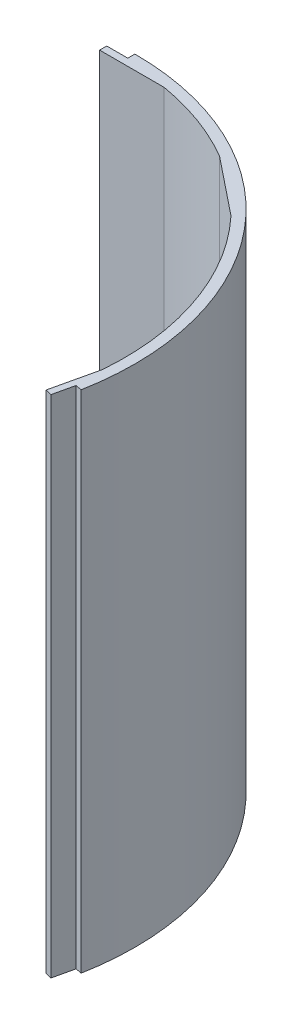
ISO-10303-21;
HEADER;
FILE_DESCRIPTION(('STEP AP214'),'2;1');
FILE_NAME('part.step','',(''),(''),'','','');
FILE_SCHEMA(('AUTOMOTIVE_DESIGN { 1 0 10303 214 1 1 1 1 }'));
ENDSEC;
DATA;
#1=APPLICATION_CONTEXT('core data for automotive mechanical design processes');
#2=APPLICATION_PROTOCOL_DEFINITION('international standard','automotive_design',2000,#1);
#3=PRODUCT_CONTEXT('',#1,'mechanical');
#4=PRODUCT('Part','Part','',(#3));
#5=PRODUCT_RELATED_PRODUCT_CATEGORY('part','',(#4));
#6=PRODUCT_DEFINITION_FORMATION('','',#4);
#7=PRODUCT_DEFINITION_CONTEXT('part definition',#1,'design');
#8=PRODUCT_DEFINITION('design','',#6,#7);
#9=PRODUCT_DEFINITION_SHAPE('','',#8);
#10=(LENGTH_UNIT() NAMED_UNIT(*) SI_UNIT(.MILLI.,.METRE.));
#11=(NAMED_UNIT(*) PLANE_ANGLE_UNIT() SI_UNIT($,.RADIAN.));
#12=(NAMED_UNIT(*) SI_UNIT($,.STERADIAN.) SOLID_ANGLE_UNIT());
#13=UNCERTAINTY_MEASURE_WITH_UNIT(LENGTH_MEASURE(1.E-05),#10,'distance_accuracy_value','');
#14=(GEOMETRIC_REPRESENTATION_CONTEXT(3) GLOBAL_UNCERTAINTY_ASSIGNED_CONTEXT((#13)) GLOBAL_UNIT_ASSIGNED_CONTEXT((#10,
#11,#12)) REPRESENTATION_CONTEXT('',''));
#15=CARTESIAN_POINT('',(0.,0.,0.));
#16=DIRECTION('',(0.,0.,1.));
#17=DIRECTION('',(1.,0.,0.));
#18=AXIS2_PLACEMENT_3D('',#15,#16,#17);
#19=CARTESIAN_POINT('',(0.,180.389576212052,0.));
#20=DIRECTION('',(0.,-1.,0.));
#21=DIRECTION('',(0.,0.,-1.));
#22=AXIS2_PLACEMENT_3D('',#19,#20,#21);
#23=CYLINDRICAL_SURFACE('',#22,49.);
#24=DIRECTION('',(0.,-1.,0.));
#25=VECTOR('',#24,1.);
#26=CARTESIAN_POINT('',(23.8221858110528,22.,-42.8194285714285));
#27=LINE('',#26,#25);
#28=CARTESIAN_POINT('',(23.8221858110528,22.,-42.8194285714285));
#29=VERTEX_POINT('',#28);
#30=CARTESIAN_POINT('',(23.8221858110528,14.7071067811865,-42.8194285714285));
#31=VERTEX_POINT('',#30);
#32=EDGE_CURVE('E231',#29,#31,#27,.T.);
#33=ORIENTED_EDGE('',*,*,#32,.F.);
#34=CARTESIAN_POINT('',(0.,22.,0.));
#35=DIRECTION('',(0.,1.,0.));
#36=DIRECTION('',(0.,0.,1.));
#37=AXIS2_PLACEMENT_3D('',#34,#35,#36);
#38=CIRCLE('',#37,49.);
#39=CARTESIAN_POINT('',(24.8620843048444,22.,-42.224125378968));
#40=VERTEX_POINT('',#39);
#41=EDGE_CURVE('E241',#40,#29,#38,.T.);
#42=ORIENTED_EDGE('',*,*,#41,.F.);
#43=DIRECTION('',(0.,-1.,0.));
#44=VECTOR('',#43,1.);
#45=CARTESIAN_POINT('',(24.8620843048444,180.389576212052,-42.224125378968));
#46=LINE('',#45,#44);
#47=CARTESIAN_POINT('',(24.8620843048444,96.,-42.224125378968));
#48=VERTEX_POINT('',#47);
#49=EDGE_CURVE('E390',#48,#40,#46,.T.);
#50=ORIENTED_EDGE('',*,*,#49,.F.);
#51=CARTESIAN_POINT('',(0.,96.,0.));
#52=DIRECTION('',(0.,1.,0.));
#53=DIRECTION('',(0.,0.,1.));
#54=AXIS2_PLACEMENT_3D('',#51,#52,#53);
#55=CIRCLE('',#54,49.);
#56=CARTESIAN_POINT('',(8.25287828578612,96.,-48.3));
#57=VERTEX_POINT('',#56);
#58=EDGE_CURVE('E426',#57,#48,#55,.F.);
#59=ORIENTED_EDGE('',*,*,#58,.F.);
#60=DIRECTION('',(0.,-1.,0.));
#61=VECTOR('',#60,1.);
#62=CARTESIAN_POINT('',(8.25287828578612,180.389576212052,-48.3));
#63=LINE('',#62,#61);
#64=CARTESIAN_POINT('',(8.25287828578612,22.,-48.3));
#65=VERTEX_POINT('',#64);
#66=EDGE_CURVE('E361',#57,#65,#63,.T.);
#67=ORIENTED_EDGE('',*,*,#66,.T.);
#68=DIRECTION('',(0.,-1.,0.));
#69=VECTOR('',#68,1.);
#70=CARTESIAN_POINT('',(8.25287828578612,22.,-48.3));
#71=LINE('',#70,#69);
#72=CARTESIAN_POINT('',(8.25287828578612,17.5,-48.3));
#73=VERTEX_POINT('',#72);
#74=EDGE_CURVE('E235',#65,#73,#71,.T.);
#75=ORIENTED_EDGE('',*,*,#74,.T.);
#76=CARTESIAN_POINT('',(0.,17.5,0.));
#77=DIRECTION('',(0.,-1.,0.));
#78=DIRECTION('',(0.,0.,-1.));
#79=AXIS2_PLACEMENT_3D('',#76,#77,#78);
#80=CIRCLE('',#79,49.);
#81=CARTESIAN_POINT('',(21.3188530280703,17.5,-44.1192305640923));
#82=VERTEX_POINT('',#81);
#83=EDGE_CURVE('E355',#82,#73,#80,.F.);
#84=ORIENTED_EDGE('',*,*,#83,.F.);
#85=CARTESIAN_POINT('',(0.,22.9599850669726,0.));
#86=DIRECTION('',(0.666989294417188,0.707106781186548,0.234787736334037));
#87=DIRECTION('',(0.666989294417188,-0.707106781186548,0.234787736334037));
#88=AXIS2_PLACEMENT_3D('',#85,#86,#87);
#89=ELLIPSE('',#88,69.2964645562816,49.);
#90=EDGE_CURVE('E250',#82,#31,#89,.F.);
#91=ORIENTED_EDGE('',*,*,#90,.T.);
#92=EDGE_LOOP('',(#33,#42,#50,#59,#67,#75,#84,#91));
#93=FACE_BOUND('',#92,.T.);
#94=ADVANCED_FACE('F39',(#93),#23,.F.);
#95=CARTESIAN_POINT('',(0.,12.,0.));
#96=DIRECTION('',(0.,1.,0.));
#97=DIRECTION('',(0.,0.,1.));
#98=AXIS2_PLACEMENT_3D('',#95,#96,#97);
#99=CIRCLE('',#98,49.);
#100=CARTESIAN_POINT('',(24.8620843048444,12.,-42.224125378968));
#101=VERTEX_POINT('',#100);
#102=CARTESIAN_POINT('',(24.2645651205459,12.,-42.5703051376283));
#103=VERTEX_POINT('',#102);
#104=EDGE_CURVE('E270',#101,#103,#99,.T.);
#105=ORIENTED_EDGE('',*,*,#104,.T.);
#106=DIRECTION('',(0.,-1.,0.));
#107=VECTOR('',#106,1.);
#108=CARTESIAN_POINT('',(24.2645651205459,180.389576212052,-42.5703051376283));
#109=LINE('',#108,#107);
#110=CARTESIAN_POINT('',(24.2645651205459,0.,-42.5703051376283));
#111=VERTEX_POINT('',#110);
#112=EDGE_CURVE('E352',#111,#103,#109,.F.);
#113=ORIENTED_EDGE('',*,*,#112,.F.);
#114=CARTESIAN_POINT('',(0.,0.,0.));
#115=DIRECTION('',(0.,-1.,0.));
#116=DIRECTION('',(0.,0.,-1.));
#117=AXIS2_PLACEMENT_3D('',#114,#115,#116);
#118=CIRCLE('',#117,49.);
#119=CARTESIAN_POINT('',(24.8620843048444,0.,-42.224125378968));
#120=VERTEX_POINT('',#119);
#121=EDGE_CURVE('E391',#111,#120,#118,.T.);
#122=ORIENTED_EDGE('',*,*,#121,.T.);
#123=EDGE_CURVE('E394',#101,#120,#46,.T.);
#124=ORIENTED_EDGE('',*,*,#123,.F.);
#125=EDGE_LOOP('',(#105,#113,#122,#124));
#126=FACE_BOUND('',#125,.T.);
#127=ADVANCED_FACE('F529',(#126),#23,.F.);
#128=CARTESIAN_POINT('',(0.,0.,0.));
#129=DIRECTION('',(0.,-1.,0.));
#130=DIRECTION('',(0.,0.,-1.));
#131=AXIS2_PLACEMENT_3D('',#128,#129,#130);
#132=PLANE('',#131);
#133=ORIENTED_EDGE('',*,*,#121,.F.);
#134=DIRECTION('',(0.332040001002474,0.,-0.943265306122449));
#135=VECTOR('',#134,1.);
#136=CARTESIAN_POINT('',(8.25628641569456,0.,2.90630571478695));
#137=LINE('',#136,#135);
#138=CARTESIAN_POINT('',(24.9390649476221,0.,-44.4864365794597));
#139=VERTEX_POINT('',#138);
#140=EDGE_CURVE('E398',#111,#139,#137,.T.);
#141=ORIENTED_EDGE('',*,*,#140,.T.);
#142=CARTESIAN_POINT('',(0.,0.,0.));
#143=DIRECTION('',(0.,1.,0.));
#144=DIRECTION('',(0.,0.,1.));
#145=AXIS2_PLACEMENT_3D('',#142,#143,#144);
#146=CIRCLE('',#145,51.);
#147=CARTESIAN_POINT('',(50.1311597152053,0.,9.37373061318567));
#148=VERTEX_POINT('',#147);
#149=EDGE_CURVE('E362',#148,#139,#146,.T.);
#150=ORIENTED_EDGE('',*,*,#149,.F.);
#151=DIRECTION('',(0.975,0.,0.222204860432889));
#152=VECTOR('',#151,1.);
#153=CARTESIAN_POINT('',(50.1311597152053,0.,9.37373061318567));
#154=LINE('',#153,#152);
#155=CARTESIAN_POINT('',(48.9506597208658,0.,9.10469180653618));
#156=VERTEX_POINT('',#155);
#157=EDGE_CURVE('E367',#156,#148,#154,.T.);
#158=ORIENTED_EDGE('',*,*,#157,.F.);
#159=DIRECTION('',(0.222204860432889,0.,-0.975));
#160=VECTOR('',#159,1.);
#161=CARTESIAN_POINT('',(48.9506597208658,0.,9.10469180653618));
#162=LINE('',#161,#160);
#163=CARTESIAN_POINT('',(48.0618402791342,0.,13.0046918065362));
#164=VERTEX_POINT('',#163);
#165=EDGE_CURVE('E371',#164,#156,#162,.T.);
#166=ORIENTED_EDGE('',*,*,#165,.F.);
#167=DIRECTION('',(0.975,0.,0.222204860432889));
#168=VECTOR('',#167,1.);
#169=CARTESIAN_POINT('',(48.0618402791342,0.,13.0046918065362));
#170=LINE('',#169,#168);
#171=CARTESIAN_POINT('',(46.8430902791342,0.,12.7269357309951));
#172=VERTEX_POINT('',#171);
#173=EDGE_CURVE('E375',#172,#164,#170,.T.);
#174=ORIENTED_EDGE('',*,*,#173,.F.);
#175=DIRECTION('',(-0.222204860432889,0.,0.975));
#176=VECTOR('',#175,1.);
#177=CARTESIAN_POINT('',(46.8430902791342,0.,12.7269357309951));
#178=LINE('',#177,#176);
#179=CARTESIAN_POINT('',(48.8389610049885,0.,3.96936870965766));
#180=VERTEX_POINT('',#179);
#181=EDGE_CURVE('E379',#180,#172,#178,.T.);
#182=ORIENTED_EDGE('',*,*,#181,.F.);
#183=CARTESIAN_POINT('',(0.,0.,0.));
#184=DIRECTION('',(0.,-1.,0.));
#185=DIRECTION('',(0.,0.,1.));
#186=AXIS2_PLACEMENT_3D('',#183,#184,#185);
#187=CIRCLE('',#186,49.);
#188=CARTESIAN_POINT('',(35.7629156951556,0.,-33.4964753516126));
#189=VERTEX_POINT('',#188);
#190=EDGE_CURVE('E383',#189,#180,#187,.T.);
#191=ORIENTED_EDGE('',*,*,#190,.F.);
#192=DIRECTION('',(0.7806247497998,0.,0.625));
#193=VECTOR('',#192,1.);
#194=CARTESIAN_POINT('',(35.7629156951556,0.,-33.4964753516126));
#195=LINE('',#194,#193);
#196=EDGE_CURVE('E387',#120,#189,#195,.T.);
#197=ORIENTED_EDGE('',*,*,#196,.F.);
#198=EDGE_LOOP('',(#133,#141,#150,#158,#166,#174,#182,#191,#197));
#199=FACE_BOUND('',#198,.T.);
#200=ADVANCED_FACE('F525',(#199),#132,.T.);
#201=CARTESIAN_POINT('',(35.7629156951556,180.389576212052,-33.4964753516126));
#202=DIRECTION('',(0.625,0.,-0.7806247497998));
#203=DIRECTION('',(-0.7806247497998,0.,-0.625));
#204=AXIS2_PLACEMENT_3D('',#201,#202,#203);
#205=PLANE('',#204);
#206=ORIENTED_EDGE('',*,*,#49,.T.);
#207=CARTESIAN_POINT('',(24.8620843048442,22.,-42.2241253789681));
#208=CARTESIAN_POINT('',(25.1031195105589,21.9559751173701,-42.0311427665025));
#209=CARTESIAN_POINT('',(25.3444302517059,21.9148005384506,-41.8379395491365));
#210=CARTESIAN_POINT('',(25.8276029012661,21.8381519727396,-41.4510918274206));
#211=CARTESIAN_POINT('',(26.0694648098991,21.8026779882227,-41.2574473228946));
#212=CARTESIAN_POINT('',(26.3116022541843,21.770054309691,-41.0635822132923));
#213=B_SPLINE_CURVE_WITH_KNOTS('',3,(#207,#208,#209,#210,#211,#212),.UNSPECIFIED.,.F.,.F.,(4,2,
4),(0.,0.935565778812049,1.87113193094878),.UNSPECIFIED.);
#214=CARTESIAN_POINT('',(26.3116022541843,21.770054309691,-41.0635822132923));
#215=VERTEX_POINT('',#214);
#216=EDGE_CURVE('E11',#40,#215,#213,.T.);
#217=ORIENTED_EDGE('',*,*,#216,.T.);
#218=DIRECTION('',(0.,-1.,0.));
#219=VECTOR('',#218,1.);
#220=CARTESIAN_POINT('',(26.3116022541843,22.,-41.0635822132923));
#221=LINE('',#220,#219);
#222=CARTESIAN_POINT('',(26.3116022541843,12.,-41.0635822132923));
#223=VERTEX_POINT('',#222);
#224=EDGE_CURVE('E269',#215,#223,#221,.T.);
#225=ORIENTED_EDGE('',*,*,#224,.T.);
#226=DIRECTION('',(-0.780624749799799,0.,-0.625000000000001));
#227=VECTOR('',#226,1.);
#228=CARTESIAN_POINT('',(26.3116022541843,12.,-41.0635822132923));
#229=LINE('',#228,#227);
#230=EDGE_CURVE('E261',#223,#101,#229,.T.);
#231=ORIENTED_EDGE('',*,*,#230,.T.);
#232=ORIENTED_EDGE('',*,*,#123,.T.);
#233=ORIENTED_EDGE('',*,*,#196,.T.);
#234=DIRECTION('',(0.,-1.,0.));
#235=VECTOR('',#234,1.);
#236=CARTESIAN_POINT('',(35.7629156951556,180.389576212052,-33.4964753516126));
#237=LINE('',#236,#235);
#238=CARTESIAN_POINT('',(35.7629156951556,96.,-33.4964753516126));
#239=VERTEX_POINT('',#238);
#240=EDGE_CURVE('E386',#239,#189,#237,.T.);
#241=ORIENTED_EDGE('',*,*,#240,.F.);
#242=DIRECTION('',(0.7806247497998,0.,0.625));
#243=VECTOR('',#242,1.);
#244=CARTESIAN_POINT('',(35.7629156951556,96.,-33.4964753516126));
#245=LINE('',#244,#243);
#246=EDGE_CURVE('E423',#48,#239,#245,.T.);
#247=ORIENTED_EDGE('',*,*,#246,.F.);
#248=EDGE_LOOP('',(#206,#217,#225,#231,#232,#233,#241,#247));
#249=FACE_BOUND('',#248,.T.);
#250=ADVANCED_FACE('F528',(#249),#205,.F.);
#251=CARTESIAN_POINT('',(0.,180.389576212052,0.));
#252=DIRECTION('',(0.,-1.,0.));
#253=DIRECTION('',(0.,0.,-1.));
#254=AXIS2_PLACEMENT_3D('',#251,#252,#253);
#255=CYLINDRICAL_SURFACE('',#254,49.);
#256=CARTESIAN_POINT('',(0.,96.,0.));
#257=DIRECTION('',(0.,1.,0.));
#258=DIRECTION('',(0.,0.,1.));
#259=AXIS2_PLACEMENT_3D('',#256,#257,#258);
#260=CIRCLE('',#259,49.);
#261=CARTESIAN_POINT('',(48.8389610049885,96.,3.96936870965766));
#262=VERTEX_POINT('',#261);
#263=EDGE_CURVE('E420',#239,#262,#260,.F.);
#264=ORIENTED_EDGE('',*,*,#263,.F.);
#265=ORIENTED_EDGE('',*,*,#240,.T.);
#266=ORIENTED_EDGE('',*,*,#190,.T.);
#267=DIRECTION('',(0.,-1.,0.));
#268=VECTOR('',#267,1.);
#269=CARTESIAN_POINT('',(48.8389610049885,180.389576212052,3.96936870965766));
#270=LINE('',#269,#268);
#271=EDGE_CURVE('E382',#262,#180,#270,.T.);
#272=ORIENTED_EDGE('',*,*,#271,.F.);
#273=EDGE_LOOP('',(#264,#265,#266,#272));
#274=FACE_BOUND('',#273,.T.);
#275=ADVANCED_FACE('F566',(#274),#255,.F.);
#276=CARTESIAN_POINT('',(46.8430902791342,180.389576212052,12.7269357309951));
#277=DIRECTION('',(0.975,0.,0.222204860432889));
#278=DIRECTION('',(0.222204860432889,0.,-0.975));
#279=AXIS2_PLACEMENT_3D('',#276,#277,#278);
#280=PLANE('',#279);
#281=DIRECTION('',(-0.222204860432889,0.,0.975));
#282=VECTOR('',#281,1.);
#283=CARTESIAN_POINT('',(46.8430902791342,96.,12.7269357309951));
#284=LINE('',#283,#282);
#285=CARTESIAN_POINT('',(46.8430902791342,96.,12.7269357309951));
#286=VERTEX_POINT('',#285);
#287=EDGE_CURVE('E417',#262,#286,#284,.T.);
#288=ORIENTED_EDGE('',*,*,#287,.F.);
#289=ORIENTED_EDGE('',*,*,#271,.T.);
#290=ORIENTED_EDGE('',*,*,#181,.T.);
#291=DIRECTION('',(0.,-1.,0.));
#292=VECTOR('',#291,1.);
#293=CARTESIAN_POINT('',(46.8430902791342,180.389576212052,12.7269357309951));
#294=LINE('',#293,#292);
#295=EDGE_CURVE('E378',#286,#172,#294,.T.);
#296=ORIENTED_EDGE('',*,*,#295,.F.);
#297=EDGE_LOOP('',(#288,#289,#290,#296));
#298=FACE_BOUND('',#297,.T.);
#299=ADVANCED_FACE('F562',(#298),#280,.F.);
#300=CARTESIAN_POINT('',(48.0618402791342,180.389576212052,13.0046918065362));
#301=DIRECTION('',(0.222204860432889,0.,-0.975));
#302=DIRECTION('',(-0.975,0.,-0.222204860432889));
#303=AXIS2_PLACEMENT_3D('',#300,#301,#302);
#304=PLANE('',#303);
#305=DIRECTION('',(0.975,0.,0.222204860432889));
#306=VECTOR('',#305,1.);
#307=CARTESIAN_POINT('',(48.0618402791342,96.,13.0046918065362));
#308=LINE('',#307,#306);
#309=CARTESIAN_POINT('',(48.0618402791342,96.,13.0046918065362));
#310=VERTEX_POINT('',#309);
#311=EDGE_CURVE('E414',#286,#310,#308,.T.);
#312=ORIENTED_EDGE('',*,*,#311,.F.);
#313=ORIENTED_EDGE('',*,*,#295,.T.);
#314=ORIENTED_EDGE('',*,*,#173,.T.);
#315=DIRECTION('',(0.,-1.,0.));
#316=VECTOR('',#315,1.);
#317=CARTESIAN_POINT('',(48.0618402791342,180.389576212052,13.0046918065362));
#318=LINE('',#317,#316);
#319=EDGE_CURVE('E374',#310,#164,#318,.T.);
#320=ORIENTED_EDGE('',*,*,#319,.F.);
#321=EDGE_LOOP('',(#312,#313,#314,#320));
#322=FACE_BOUND('',#321,.T.);
#323=ADVANCED_FACE('F558',(#322),#304,.F.);
#324=CARTESIAN_POINT('',(48.9506597208658,180.389576212052,9.10469180653618));
#325=DIRECTION('',(-0.975,0.,-0.222204860432889));
#326=DIRECTION('',(-0.222204860432889,0.,0.975));
#327=AXIS2_PLACEMENT_3D('',#324,#325,#326);
#328=PLANE('',#327);
#329=DIRECTION('',(0.222204860432889,0.,-0.975));
#330=VECTOR('',#329,1.);
#331=CARTESIAN_POINT('',(48.9506597208658,96.,9.10469180653618));
#332=LINE('',#331,#330);
#333=CARTESIAN_POINT('',(48.9506597208658,96.,9.10469180653618));
#334=VERTEX_POINT('',#333);
#335=EDGE_CURVE('E411',#310,#334,#332,.T.);
#336=ORIENTED_EDGE('',*,*,#335,.F.);
#337=ORIENTED_EDGE('',*,*,#319,.T.);
#338=ORIENTED_EDGE('',*,*,#165,.T.);
#339=DIRECTION('',(0.,-1.,0.));
#340=VECTOR('',#339,1.);
#341=CARTESIAN_POINT('',(48.9506597208658,180.389576212052,9.10469180653618));
#342=LINE('',#341,#340);
#343=EDGE_CURVE('E370',#334,#156,#342,.T.);
#344=ORIENTED_EDGE('',*,*,#343,.F.);
#345=EDGE_LOOP('',(#336,#337,#338,#344));
#346=FACE_BOUND('',#345,.T.);
#347=ADVANCED_FACE('F554',(#346),#328,.F.);
#348=CARTESIAN_POINT('',(50.1311597152053,180.389576212052,9.37373061318567));
#349=DIRECTION('',(0.222204860432889,0.,-0.975));
#350=DIRECTION('',(-0.975,0.,-0.222204860432889));
#351=AXIS2_PLACEMENT_3D('',#348,#349,#350);
#352=PLANE('',#351);
#353=DIRECTION('',(0.975,0.,0.222204860432889));
#354=VECTOR('',#353,1.);
#355=CARTESIAN_POINT('',(50.1311597152053,96.,9.37373061318567));
#356=LINE('',#355,#354);
#357=CARTESIAN_POINT('',(50.1311597152053,96.,9.37373061318567));
#358=VERTEX_POINT('',#357);
#359=EDGE_CURVE('E408',#334,#358,#356,.T.);
#360=ORIENTED_EDGE('',*,*,#359,.F.);
#361=ORIENTED_EDGE('',*,*,#343,.T.);
#362=ORIENTED_EDGE('',*,*,#157,.T.);
#363=DIRECTION('',(0.,-1.,0.));
#364=VECTOR('',#363,1.);
#365=CARTESIAN_POINT('',(50.1311597152053,180.389576212052,9.37373061318567));
#366=LINE('',#365,#364);
#367=EDGE_CURVE('E366',#358,#148,#366,.T.);
#368=ORIENTED_EDGE('',*,*,#367,.F.);
#369=EDGE_LOOP('',(#360,#361,#362,#368));
#370=FACE_BOUND('',#369,.T.);
#371=ADVANCED_FACE('F550',(#370),#352,.F.);
#372=CARTESIAN_POINT('',(0.,180.389576212052,0.));
#373=DIRECTION('',(0.,-1.,0.));
#374=DIRECTION('',(0.,0.,-1.));
#375=AXIS2_PLACEMENT_3D('',#372,#373,#374);
#376=CYLINDRICAL_SURFACE('',#375,51.);
#377=CARTESIAN_POINT('',(0.,24.2071067811866,0.));
#378=DIRECTION('',(0.707106781186547,0.707106781186548,0.));
#379=DIRECTION('',(0.707106781186548,-0.707106781186547,0.));
#380=AXIS2_PLACEMENT_3D('',#377,#378,#379);
#381=ELLIPSE('',#380,72.1248916810278,51.);
#382=CARTESIAN_POINT('',(6.70710678118656,17.5,-50.5570442038076));
#383=VERTEX_POINT('',#382);
#384=CARTESIAN_POINT('',(3.70710678118656,20.5,-50.8650897896866));
#385=VERTEX_POINT('',#384);
#386=EDGE_CURVE('E320',#383,#385,#381,.T.);
#387=ORIENTED_EDGE('',*,*,#386,.T.);
#388=CARTESIAN_POINT('',(0.,20.5,0.));
#389=DIRECTION('',(0.,1.,0.));
#390=DIRECTION('',(0.,0.,1.));
#391=AXIS2_PLACEMENT_3D('',#388,#389,#390);
#392=CIRCLE('',#391,51.);
#393=CARTESIAN_POINT('',(0.,20.5,-51.));
#394=VERTEX_POINT('',#393);
#395=EDGE_CURVE('E337',#385,#394,#392,.T.);
#396=ORIENTED_EDGE('',*,*,#395,.T.);
#397=DIRECTION('',(0.,-1.,0.));
#398=VECTOR('',#397,1.);
#399=CARTESIAN_POINT('',(0.,180.389576212052,-51.));
#400=LINE('',#399,#398);
#401=CARTESIAN_POINT('',(0.,96.,-51.));
#402=VERTEX_POINT('',#401);
#403=EDGE_CURVE('E365',#402,#394,#400,.T.);
#404=ORIENTED_EDGE('',*,*,#403,.F.);
#405=CARTESIAN_POINT('',(0.,96.,0.));
#406=DIRECTION('',(0.,1.,0.));
#407=DIRECTION('',(0.,0.,1.));
#408=AXIS2_PLACEMENT_3D('',#405,#406,#407);
#409=CIRCLE('',#408,51.);
#410=EDGE_CURVE('E405',#358,#402,#409,.T.);
#411=ORIENTED_EDGE('',*,*,#410,.F.);
#412=ORIENTED_EDGE('',*,*,#367,.T.);
#413=ORIENTED_EDGE('',*,*,#149,.T.);
#414=DIRECTION('',(0.,-1.,0.));
#415=VECTOR('',#414,1.);
#416=CARTESIAN_POINT('',(24.9390649476221,180.389576212052,-44.4864365794597));
#417=LINE('',#416,#415);
#418=CARTESIAN_POINT('',(24.9390649476221,14.2071067811865,-44.4864365794597));
#419=VERTEX_POINT('',#418);
#420=EDGE_CURVE('E347',#419,#139,#417,.T.);
#421=ORIENTED_EDGE('',*,*,#420,.F.);
#422=CARTESIAN_POINT('',(0.,22.9599850669726,0.));
#423=DIRECTION('',(0.666989294417188,0.707106781186548,0.234787736334037));
#424=DIRECTION('',(0.666989294417188,-0.707106781186548,0.234787736334037));
#425=AXIS2_PLACEMENT_3D('',#422,#423,#424);
#426=ELLIPSE('',#425,72.1248916810278,51.);
#427=CARTESIAN_POINT('',(21.9869298650982,17.5,-46.0171154583515));
#428=VERTEX_POINT('',#427);
#429=EDGE_CURVE('E457',#419,#428,#426,.T.);
#430=ORIENTED_EDGE('',*,*,#429,.T.);
#431=CARTESIAN_POINT('',(0.,17.5,0.));
#432=DIRECTION('',(0.,-1.,0.));
#433=DIRECTION('',(0.,0.,-1.));
#434=AXIS2_PLACEMENT_3D('',#431,#432,#433);
#435=CIRCLE('',#434,51.);
#436=EDGE_CURVE('E358',#383,#428,#435,.T.);
#437=ORIENTED_EDGE('',*,*,#436,.F.);
#438=EDGE_LOOP('',(#387,#396,#404,#411,#412,#413,#421,#430,#437));
#439=FACE_BOUND('',#438,.T.);
#440=ADVANCED_FACE('F546',(#439),#376,.T.);
#441=CARTESIAN_POINT('',(0.,180.389576212052,-49.65));
#442=DIRECTION('',(1.,0.,0.));
#443=DIRECTION('',(0.,0.,-1.));
#444=AXIS2_PLACEMENT_3D('',#441,#442,#443);
#445=PLANE('',#444);
#446=ORIENTED_EDGE('',*,*,#403,.T.);
#447=DIRECTION('',(0.,0.,1.));
#448=VECTOR('',#447,1.);
#449=CARTESIAN_POINT('',(0.,20.5,-49.65));
#450=LINE('',#449,#448);
#451=CARTESIAN_POINT('',(0.,20.5,-49.65));
#452=VERTEX_POINT('',#451);
#453=EDGE_CURVE('E334',#394,#452,#450,.T.);
#454=ORIENTED_EDGE('',*,*,#453,.T.);
#455=DIRECTION('',(0.,-1.,0.));
#456=VECTOR('',#455,1.);
#457=CARTESIAN_POINT('',(0.,180.389576212052,-49.65));
#458=LINE('',#457,#456);
#459=CARTESIAN_POINT('',(0.,96.,-49.65));
#460=VERTEX_POINT('',#459);
#461=EDGE_CURVE('E442',#460,#452,#458,.T.);
#462=ORIENTED_EDGE('',*,*,#461,.F.);
#463=DIRECTION('',(0.,0.,1.));
#464=VECTOR('',#463,1.);
#465=CARTESIAN_POINT('',(0.,96.,-49.65));
#466=LINE('',#465,#464);
#467=EDGE_CURVE('E402',#402,#460,#466,.T.);
#468=ORIENTED_EDGE('',*,*,#467,.F.);
#469=EDGE_LOOP('',(#446,#454,#462,#468));
#470=FACE_BOUND('',#469,.T.);
#471=ADVANCED_FACE('F542',(#470),#445,.F.);
#472=CARTESIAN_POINT('',(-3.99999999999999,180.389576212052,-49.65));
#473=DIRECTION('',(0.,0.,1.));
#474=DIRECTION('',(1.,0.,0.));
#475=AXIS2_PLACEMENT_3D('',#472,#473,#474);
#476=PLANE('',#475);
#477=DIRECTION('',(-1.,0.,0.));
#478=VECTOR('',#477,1.);
#479=CARTESIAN_POINT('',(-3.99999999999999,20.5,-49.65));
#480=LINE('',#479,#478);
#481=CARTESIAN_POINT('',(-3.70710678118655,20.5,-49.65));
#482=VERTEX_POINT('',#481);
#483=EDGE_CURVE('E331',#452,#482,#480,.T.);
#484=ORIENTED_EDGE('',*,*,#483,.T.);
#485=DIRECTION('',(-0.707106781186556,-0.707106781186539,0.));
#486=VECTOR('',#485,1.);
#487=CARTESIAN_POINT('',(76.0912347154325,100.298341496617,-49.65));
#488=LINE('',#487,#486);
#489=CARTESIAN_POINT('',(-3.99999999999999,20.2071067811866,-49.65));
#490=VERTEX_POINT('',#489);
#491=EDGE_CURVE('E340',#482,#490,#488,.T.);
#492=ORIENTED_EDGE('',*,*,#491,.T.);
#493=DIRECTION('',(0.,-1.,0.));
#494=VECTOR('',#493,1.);
#495=CARTESIAN_POINT('',(-3.99999999999999,180.389576212052,-49.65));
#496=LINE('',#495,#494);
#497=CARTESIAN_POINT('',(-3.99999999999999,96.,-49.65));
#498=VERTEX_POINT('',#497);
#499=EDGE_CURVE('E445',#498,#490,#496,.T.);
#500=ORIENTED_EDGE('',*,*,#499,.F.);
#501=DIRECTION('',(-1.,0.,0.));
#502=VECTOR('',#501,1.);
#503=CARTESIAN_POINT('',(-3.99999999999999,96.,-49.65));
#504=LINE('',#503,#502);
#505=EDGE_CURVE('E399',#460,#498,#504,.T.);
#506=ORIENTED_EDGE('',*,*,#505,.F.);
#507=ORIENTED_EDGE('',*,*,#461,.T.);
#508=EDGE_LOOP('',(#484,#492,#500,#506,#507));
#509=FACE_BOUND('',#508,.T.);
#510=ADVANCED_FACE('F538',(#509),#476,.F.);
#511=CARTESIAN_POINT('',(-3.99999999999999,180.389576212052,-48.3));
#512=DIRECTION('',(1.,0.,0.));
#513=DIRECTION('',(0.,0.,-1.));
#514=AXIS2_PLACEMENT_3D('',#511,#512,#513);
#515=PLANE('',#514);
#516=DIRECTION('',(0.,-1.,0.));
#517=VECTOR('',#516,1.);
#518=CARTESIAN_POINT('',(-4.,22.,-47.3));
#519=LINE('',#518,#517);
#520=CARTESIAN_POINT('',(-4.,21.,-47.3));
#521=VERTEX_POINT('',#520);
#522=CARTESIAN_POINT('',(-4.,12.,-47.3));
#523=VERTEX_POINT('',#522);
#524=EDGE_CURVE('E300',#521,#523,#519,.T.);
#525=ORIENTED_EDGE('',*,*,#524,.F.);
#526=DIRECTION('',(0.,0.707106781186548,-0.707106781186548));
#527=VECTOR('',#526,1.);
#528=CARTESIAN_POINT('',(-3.99999999999999,22.,-48.3));
#529=LINE('',#528,#527);
#530=CARTESIAN_POINT('',(-3.99999999999999,22.,-48.3));
#531=VERTEX_POINT('',#530);
#532=EDGE_CURVE('E49',#521,#531,#529,.T.);
#533=ORIENTED_EDGE('',*,*,#532,.T.);
#534=DIRECTION('',(0.,-1.,0.));
#535=VECTOR('',#534,1.);
#536=CARTESIAN_POINT('',(-3.99999999999999,180.389576212052,-48.3));
#537=LINE('',#536,#535);
#538=CARTESIAN_POINT('',(-3.99999999999999,96.,-48.3));
#539=VERTEX_POINT('',#538);
#540=EDGE_CURVE('E432',#539,#531,#537,.T.);
#541=ORIENTED_EDGE('',*,*,#540,.F.);
#542=DIRECTION('',(0.,0.,1.));
#543=VECTOR('',#542,1.);
#544=CARTESIAN_POINT('',(-3.99999999999999,96.,-48.3));
#545=LINE('',#544,#543);
#546=EDGE_CURVE('E395',#498,#539,#545,.T.);
#547=ORIENTED_EDGE('',*,*,#546,.F.);
#548=ORIENTED_EDGE('',*,*,#499,.T.);
#549=DIRECTION('',(0.,0.,1.));
#550=VECTOR('',#549,1.);
#551=CARTESIAN_POINT('',(-3.99999999999999,20.2071067811866,-51.));
#552=LINE('',#551,#550);
#553=CARTESIAN_POINT('',(-3.99999999999999,20.2071067811866,-48.3));
#554=VERTEX_POINT('',#553);
#555=EDGE_CURVE('E316',#490,#554,#552,.T.);
#556=ORIENTED_EDGE('',*,*,#555,.T.);
#557=DIRECTION('',(0.,-1.,0.));
#558=VECTOR('',#557,1.);
#559=CARTESIAN_POINT('',(-3.99999999999999,22.,-48.3));
#560=LINE('',#559,#558);
#561=CARTESIAN_POINT('',(-3.99999999999999,12.,-48.3));
#562=VERTEX_POINT('',#561);
#563=EDGE_CURVE('E302',#554,#562,#560,.T.);
#564=ORIENTED_EDGE('',*,*,#563,.T.);
#565=DIRECTION('',(0.,0.,1.));
#566=VECTOR('',#565,1.);
#567=CARTESIAN_POINT('',(-4.,12.,-47.3));
#568=LINE('',#567,#566);
#569=EDGE_CURVE('E279',#562,#523,#568,.T.);
#570=ORIENTED_EDGE('',*,*,#569,.T.);
#571=EDGE_LOOP('',(#525,#533,#541,#547,#548,#556,#564,#570));
#572=FACE_BOUND('',#571,.T.);
#573=ADVANCED_FACE('F534',(#572),#515,.F.);
#574=CARTESIAN_POINT('',(-3.99999999999999,180.389576212052,-48.3));
#575=DIRECTION('',(0.,0.,-1.));
#576=DIRECTION('',(-1.,0.,0.));
#577=AXIS2_PLACEMENT_3D('',#574,#575,#576);
#578=PLANE('',#577);
#579=ORIENTED_EDGE('',*,*,#540,.T.);
#580=DIRECTION('',(-1.,0.,0.));
#581=VECTOR('',#580,1.);
#582=CARTESIAN_POINT('',(-3.99999999999999,22.,-48.3));
#583=LINE('',#582,#581);
#584=EDGE_CURVE('E240',#65,#531,#583,.T.);
#585=ORIENTED_EDGE('',*,*,#584,.F.);
#586=ORIENTED_EDGE('',*,*,#66,.F.);
#587=DIRECTION('',(1.,0.,0.));
#588=VECTOR('',#587,1.);
#589=CARTESIAN_POINT('',(-3.99999999999999,96.,-48.3));
#590=LINE('',#589,#588);
#591=EDGE_CURVE('E429',#539,#57,#590,.T.);
#592=ORIENTED_EDGE('',*,*,#591,.F.);
#593=EDGE_LOOP('',(#579,#585,#586,#592));
#594=FACE_BOUND('',#593,.T.);
#595=ADVANCED_FACE('F531',(#594),#578,.F.);
#596=CARTESIAN_POINT('',(0.,96.,0.));
#597=DIRECTION('',(0.,1.,0.));
#598=DIRECTION('',(0.,0.,1.));
#599=AXIS2_PLACEMENT_3D('',#596,#597,#598);
#600=PLANE('',#599);
#601=ORIENTED_EDGE('',*,*,#591,.T.);
#602=ORIENTED_EDGE('',*,*,#58,.T.);
#603=ORIENTED_EDGE('',*,*,#246,.T.);
#604=ORIENTED_EDGE('',*,*,#263,.T.);
#605=ORIENTED_EDGE('',*,*,#287,.T.);
#606=ORIENTED_EDGE('',*,*,#311,.T.);
#607=ORIENTED_EDGE('',*,*,#335,.T.);
#608=ORIENTED_EDGE('',*,*,#359,.T.);
#609=ORIENTED_EDGE('',*,*,#410,.T.);
#610=ORIENTED_EDGE('',*,*,#467,.T.);
#611=ORIENTED_EDGE('',*,*,#505,.T.);
#612=ORIENTED_EDGE('',*,*,#546,.T.);
#613=EDGE_LOOP('',(#601,#602,#603,#604,#605,#606,#607,#608,#609,#610,#611,#612));
#614=FACE_BOUND('',#613,.T.);
#615=ADVANCED_FACE('F520',(#614),#600,.T.);
#616=CARTESIAN_POINT('',(32.4247498196496,11.4799925334863,-57.5386970648363));
#617=DIRECTION('',(0.666989294417188,0.707106781186548,0.234787736334037));
#618=DIRECTION('',(-0.72744118844636,0.686170035305934,0.));
#619=AXIS2_PLACEMENT_3D('',#616,#617,#618);
#620=PLANE('',#619);
#621=DIRECTION('',(-0.332040001002474,0.,0.943265306122449));
#622=VECTOR('',#621,1.);
#623=CARTESIAN_POINT('',(26.7462856338891,17.5,-59.5375803500524));
#624=LINE('',#623,#622);
#625=EDGE_CURVE('E344',#428,#82,#624,.T.);
#626=ORIENTED_EDGE('',*,*,#625,.F.);
#627=ORIENTED_EDGE('',*,*,#429,.F.);
#628=DIRECTION('',(-0.332040001002474,0.,0.943265306122449));
#629=VECTOR('',#628,1.);
#630=CARTESIAN_POINT('',(29.8523575639618,14.2071067811865,-58.4442080823765));
#631=LINE('',#630,#629);
#632=CARTESIAN_POINT('',(24.2645651205459,14.2071067811865,-42.5703051376283));
#633=VERTEX_POINT('',#632);
#634=EDGE_CURVE('E343',#419,#633,#631,.T.);
#635=ORIENTED_EDGE('',*,*,#634,.T.);
#636=CARTESIAN_POINT('',(0.,22.9599850669726,0.));
#637=DIRECTION('',(0.666989294417188,0.707106781186548,0.234787736334037));
#638=DIRECTION('',(0.666989294417188,-0.707106781186548,0.234787736334037));
#639=AXIS2_PLACEMENT_3D('',#636,#637,#638);
#640=ELLIPSE('',#639,69.2964645562816,49.);
#641=EDGE_CURVE('E251',#31,#633,#640,.F.);
#642=ORIENTED_EDGE('',*,*,#641,.F.);
#643=ORIENTED_EDGE('',*,*,#90,.F.);
#644=EDGE_LOOP('',(#626,#627,#635,#642,#643));
#645=FACE_BOUND('',#644,.T.);
#646=ADVANCED_FACE('F516',(#645),#620,.F.);
#647=CARTESIAN_POINT('',(21.5960711482672,17.5,-61.3505137971635));
#648=DIRECTION('',(0.,-1.,0.));
#649=DIRECTION('',(0.,0.,-1.));
#650=AXIS2_PLACEMENT_3D('',#647,#648,#649);
#651=PLANE('',#650);
#652=ORIENTED_EDGE('',*,*,#436,.T.);
#653=ORIENTED_EDGE('',*,*,#625,.T.);
#654=ORIENTED_EDGE('',*,*,#83,.T.);
#655=DIRECTION('',(-1.,0.,0.));
#656=VECTOR('',#655,1.);
#657=CARTESIAN_POINT('',(-3.99999999999999,17.5,-48.3));
#658=LINE('',#657,#656);
#659=CARTESIAN_POINT('',(6.70710678118656,17.5,-48.3));
#660=VERTEX_POINT('',#659);
#661=EDGE_CURVE('E454',#73,#660,#658,.T.);
#662=ORIENTED_EDGE('',*,*,#661,.T.);
#663=DIRECTION('',(0.,0.,1.));
#664=VECTOR('',#663,1.);
#665=CARTESIAN_POINT('',(6.70710678118656,17.5,-51.));
#666=LINE('',#665,#664);
#667=EDGE_CURVE('E324',#383,#660,#666,.T.);
#668=ORIENTED_EDGE('',*,*,#667,.F.);
#669=EDGE_LOOP('',(#652,#653,#654,#662,#668));
#670=FACE_BOUND('',#669,.T.);
#671=ADVANCED_FACE('F513',(#670),#651,.T.);
#672=CARTESIAN_POINT('',(29.8523575639618,0.,-58.4442080823765));
#673=DIRECTION('',(-0.943265306122449,0.,-0.332040001002474));
#674=DIRECTION('',(-0.332040001002474,0.,0.943265306122449));
#675=AXIS2_PLACEMENT_3D('',#672,#673,#674);
#676=PLANE('',#675);
#677=ORIENTED_EDGE('',*,*,#112,.T.);
#678=EDGE_CURVE('E351',#103,#633,#109,.F.);
#679=ORIENTED_EDGE('',*,*,#678,.T.);
#680=ORIENTED_EDGE('',*,*,#634,.F.);
#681=ORIENTED_EDGE('',*,*,#420,.T.);
#682=ORIENTED_EDGE('',*,*,#140,.F.);
#683=EDGE_LOOP('',(#677,#679,#680,#681,#682));
#684=FACE_BOUND('',#683,.T.);
#685=ADVANCED_FACE('F511',(#684),#676,.T.);
#686=CARTESIAN_POINT('',(-12.1035533905932,12.1035533905935,-51.));
#687=DIRECTION('',(-0.707106781186539,0.707106781186556,0.));
#688=DIRECTION('',(-0.707106781186556,-0.707106781186539,0.));
#689=AXIS2_PLACEMENT_3D('',#686,#687,#688);
#690=PLANE('',#689);
#691=DIRECTION('',(0.,0.,1.));
#692=VECTOR('',#691,1.);
#693=CARTESIAN_POINT('',(-3.70710678118655,20.5,-51.));
#694=LINE('',#693,#692);
#695=CARTESIAN_POINT('',(-3.70710678118655,20.5,-48.3));
#696=VERTEX_POINT('',#695);
#697=EDGE_CURVE('E317',#482,#696,#694,.T.);
#698=ORIENTED_EDGE('',*,*,#697,.T.);
#699=DIRECTION('',(-0.707106781186556,-0.707106781186539,0.));
#700=VECTOR('',#699,1.);
#701=CARTESIAN_POINT('',(-12.1035533905932,12.1035533905935,-48.3));
#702=LINE('',#701,#700);
#703=EDGE_CURVE('E307',#696,#554,#702,.T.);
#704=ORIENTED_EDGE('',*,*,#703,.T.);
#705=ORIENTED_EDGE('',*,*,#555,.F.);
#706=ORIENTED_EDGE('',*,*,#491,.F.);
#707=EDGE_LOOP('',(#698,#704,#705,#706));
#708=FACE_BOUND('',#707,.T.);
#709=ADVANCED_FACE('F504',(#708),#690,.F.);
#710=CARTESIAN_POINT('',(0.,20.5,-51.));
#711=DIRECTION('',(0.,1.,0.));
#712=DIRECTION('',(0.,0.,1.));
#713=AXIS2_PLACEMENT_3D('',#710,#711,#712);
#714=PLANE('',#713);
#715=DIRECTION('',(0.,0.,1.));
#716=VECTOR('',#715,1.);
#717=CARTESIAN_POINT('',(3.70710678118656,20.5,-51.));
#718=LINE('',#717,#716);
#719=CARTESIAN_POINT('',(3.70710678118656,20.5,-48.3));
#720=VERTEX_POINT('',#719);
#721=EDGE_CURVE('E321',#385,#720,#718,.T.);
#722=ORIENTED_EDGE('',*,*,#721,.T.);
#723=DIRECTION('',(-1.,0.,0.));
#724=VECTOR('',#723,1.);
#725=CARTESIAN_POINT('',(0.,20.5,-48.3));
#726=LINE('',#725,#724);
#727=EDGE_CURVE('E313',#720,#696,#726,.T.);
#728=ORIENTED_EDGE('',*,*,#727,.T.);
#729=ORIENTED_EDGE('',*,*,#697,.F.);
#730=ORIENTED_EDGE('',*,*,#483,.F.);
#731=ORIENTED_EDGE('',*,*,#453,.F.);
#732=ORIENTED_EDGE('',*,*,#395,.F.);
#733=EDGE_LOOP('',(#722,#728,#729,#730,#731,#732));
#734=FACE_BOUND('',#733,.T.);
#735=ADVANCED_FACE('F501',(#734),#714,.F.);
#736=CARTESIAN_POINT('',(12.1035533905933,12.1035533905933,-51.));
#737=DIRECTION('',(0.707106781186547,0.707106781186548,0.));
#738=DIRECTION('',(-0.707106781186548,0.707106781186547,0.));
#739=AXIS2_PLACEMENT_3D('',#736,#737,#738);
#740=PLANE('',#739);
#741=ORIENTED_EDGE('',*,*,#667,.T.);
#742=DIRECTION('',(-0.707106781186548,0.707106781186547,0.));
#743=VECTOR('',#742,1.);
#744=CARTESIAN_POINT('',(12.1035533905933,12.1035533905933,-48.3));
#745=LINE('',#744,#743);
#746=EDGE_CURVE('E310',#660,#720,#745,.T.);
#747=ORIENTED_EDGE('',*,*,#746,.T.);
#748=ORIENTED_EDGE('',*,*,#721,.F.);
#749=ORIENTED_EDGE('',*,*,#386,.F.);
#750=EDGE_LOOP('',(#741,#747,#748,#749));
#751=FACE_BOUND('',#750,.T.);
#752=ADVANCED_FACE('F499',(#751),#740,.F.);
#753=CARTESIAN_POINT('',(0.,22.,0.));
#754=DIRECTION('',(0.,-1.,0.));
#755=DIRECTION('',(0.,0.,-1.));
#756=AXIS2_PLACEMENT_3D('',#753,#754,#755);
#757=CYLINDRICAL_SURFACE('',#756,49.);
#758=CARTESIAN_POINT('',(23.8221858110528,12.,-42.8194285714285));
#759=VERTEX_POINT('',#758);
#760=EDGE_CURVE('E252',#31,#759,#27,.T.);
#761=ORIENTED_EDGE('',*,*,#760,.F.);
#762=ORIENTED_EDGE('',*,*,#641,.T.);
#763=ORIENTED_EDGE('',*,*,#678,.F.);
#764=EDGE_CURVE('E274',#103,#759,#99,.T.);
#765=ORIENTED_EDGE('',*,*,#764,.T.);
#766=EDGE_LOOP('',(#761,#762,#763,#765));
#767=FACE_BOUND('',#766,.T.);
#768=ADVANCED_FACE('F496',(#767),#757,.T.);
#769=CARTESIAN_POINT('',(8.25287828578612,22.,-48.3));
#770=DIRECTION('',(-0.332040001002474,0.,0.943265306122449));
#771=DIRECTION('',(0.943265306122449,0.,0.332040001002474));
#772=AXIS2_PLACEMENT_3D('',#769,#770,#771);
#773=PLANE('',#772);
#774=DIRECTION('',(-0.943265306122449,0.,-0.332040001002474));
#775=VECTOR('',#774,1.);
#776=CARTESIAN_POINT('',(8.25287828578612,12.,-48.3));
#777=LINE('',#776,#775);
#778=CARTESIAN_POINT('',(8.25287828578612,12.,-48.3));
#779=VERTEX_POINT('',#778);
#780=EDGE_CURVE('E273',#759,#779,#777,.T.);
#781=ORIENTED_EDGE('',*,*,#780,.T.);
#782=EDGE_CURVE('E304',#73,#779,#71,.T.);
#783=ORIENTED_EDGE('',*,*,#782,.F.);
#784=ORIENTED_EDGE('',*,*,#74,.F.);
#785=DIRECTION('',(-0.943265306122449,0.,-0.332040001002474));
#786=VECTOR('',#785,1.);
#787=CARTESIAN_POINT('',(23.8221858110528,22.,-42.8194285714285));
#788=LINE('',#787,#786);
#789=EDGE_CURVE('E227',#29,#65,#788,.T.);
#790=ORIENTED_EDGE('',*,*,#789,.F.);
#791=ORIENTED_EDGE('',*,*,#32,.T.);
#792=ORIENTED_EDGE('',*,*,#760,.T.);
#793=EDGE_LOOP('',(#781,#783,#784,#790,#791,#792));
#794=FACE_BOUND('',#793,.T.);
#795=ADVANCED_FACE('F230',(#794),#773,.F.);
#796=CARTESIAN_POINT('',(-3.99999999999999,22.,-48.3));
#797=DIRECTION('',(0.,0.,1.));
#798=DIRECTION('',(1.,0.,0.));
#799=AXIS2_PLACEMENT_3D('',#796,#797,#798);
#800=PLANE('',#799);
#801=ORIENTED_EDGE('',*,*,#661,.F.);
#802=ORIENTED_EDGE('',*,*,#782,.T.);
#803=DIRECTION('',(-1.,0.,0.));
#804=VECTOR('',#803,1.);
#805=CARTESIAN_POINT('',(-3.99999999999999,12.,-48.3));
#806=LINE('',#805,#804);
#807=EDGE_CURVE('E276',#779,#562,#806,.T.);
#808=ORIENTED_EDGE('',*,*,#807,.T.);
#809=ORIENTED_EDGE('',*,*,#563,.F.);
#810=ORIENTED_EDGE('',*,*,#703,.F.);
#811=ORIENTED_EDGE('',*,*,#727,.F.);
#812=ORIENTED_EDGE('',*,*,#746,.F.);
#813=EDGE_LOOP('',(#801,#802,#808,#809,#810,#811,#812));
#814=FACE_BOUND('',#813,.T.);
#815=ADVANCED_FACE('F490',(#814),#800,.F.);
#816=CARTESIAN_POINT('',(-4.,22.,-47.3));
#817=DIRECTION('',(0.,0.,-1.));
#818=DIRECTION('',(-1.,0.,0.));
#819=AXIS2_PLACEMENT_3D('',#816,#817,#818);
#820=PLANE('',#819);
#821=DIRECTION('',(0.,-1.,0.));
#822=VECTOR('',#821,1.);
#823=CARTESIAN_POINT('',(8.08201124053176,22.,-47.3));
#824=LINE('',#823,#822);
#825=CARTESIAN_POINT('',(8.08201124053176,21.,-47.3));
#826=VERTEX_POINT('',#825);
#827=CARTESIAN_POINT('',(8.08201124053176,12.,-47.3));
#828=VERTEX_POINT('',#827);
#829=EDGE_CURVE('E298',#826,#828,#824,.T.);
#830=ORIENTED_EDGE('',*,*,#829,.F.);
#831=DIRECTION('',(-1.,0.,0.));
#832=VECTOR('',#831,1.);
#833=CARTESIAN_POINT('',(-4.,21.,-47.3));
#834=LINE('',#833,#832);
#835=EDGE_CURVE('E57',#826,#521,#834,.T.);
#836=ORIENTED_EDGE('',*,*,#835,.T.);
#837=ORIENTED_EDGE('',*,*,#524,.T.);
#838=DIRECTION('',(1.,0.,0.));
#839=VECTOR('',#838,1.);
#840=CARTESIAN_POINT('',(-4.,12.,-47.3));
#841=LINE('',#840,#839);
#842=EDGE_CURVE('E282',#523,#828,#841,.T.);
#843=ORIENTED_EDGE('',*,*,#842,.T.);
#844=EDGE_LOOP('',(#830,#836,#837,#843));
#845=FACE_BOUND('',#844,.T.);
#846=ADVANCED_FACE('F487',(#845),#820,.F.);
#847=CARTESIAN_POINT('',(23.4097236762852,22.,-41.9044727612694));
#848=DIRECTION('',(0.332040001002474,0.,-0.943265306122449));
#849=DIRECTION('',(-0.943265306122449,0.,-0.332040001002474));
#850=AXIS2_PLACEMENT_3D('',#847,#848,#849);
#851=PLANE('',#850);
#852=DIRECTION('',(0.,-1.,0.));
#853=VECTOR('',#852,1.);
#854=CARTESIAN_POINT('',(23.4097236762853,22.,-41.9044727612694));
#855=LINE('',#854,#853);
#856=CARTESIAN_POINT('',(23.4097236762853,21.,-41.9044727612694));
#857=VERTEX_POINT('',#856);
#858=CARTESIAN_POINT('',(23.4097236762853,12.,-41.9044727612694));
#859=VERTEX_POINT('',#858);
#860=EDGE_CURVE('E296',#857,#859,#855,.T.);
#861=ORIENTED_EDGE('',*,*,#860,.F.);
#862=DIRECTION('',(-0.943265306122449,0.,-0.332040001002474));
#863=VECTOR('',#862,1.);
#864=CARTESIAN_POINT('',(8.08201124053176,21.,-47.3));
#865=LINE('',#864,#863);
#866=EDGE_CURVE('E65',#857,#826,#865,.T.);
#867=ORIENTED_EDGE('',*,*,#866,.T.);
#868=ORIENTED_EDGE('',*,*,#829,.T.);
#869=DIRECTION('',(0.943265306122449,0.,0.332040001002474));
#870=VECTOR('',#869,1.);
#871=CARTESIAN_POINT('',(23.4097236762852,12.,-41.9044727612694));
#872=LINE('',#871,#870);
#873=EDGE_CURVE('E285',#828,#859,#872,.T.);
#874=ORIENTED_EDGE('',*,*,#873,.T.);
#875=EDGE_LOOP('',(#861,#867,#868,#874));
#876=FACE_BOUND('',#875,.T.);
#877=ADVANCED_FACE('F483',(#876),#851,.F.);
#878=CARTESIAN_POINT('',(0.,22.,0.));
#879=DIRECTION('',(0.,-1.,0.));
#880=DIRECTION('',(0.,0.,-1.));
#881=AXIS2_PLACEMENT_3D('',#878,#879,#880);
#882=CYLINDRICAL_SURFACE('',#881,48.);
#883=DIRECTION('',(0.,-1.,0.));
#884=VECTOR('',#883,1.);
#885=CARTESIAN_POINT('',(24.3546948292353,22.,-41.3624085344993));
#886=LINE('',#885,#884);
#887=CARTESIAN_POINT('',(24.3546948292353,21.,-41.3624085344993));
#888=VERTEX_POINT('',#887);
#889=CARTESIAN_POINT('',(24.3546948292353,12.,-41.3624085344993));
#890=VERTEX_POINT('',#889);
#891=EDGE_CURVE('E294',#888,#890,#886,.T.);
#892=ORIENTED_EDGE('',*,*,#891,.F.);
#893=CARTESIAN_POINT('',(0.,21.,0.));
#894=DIRECTION('',(0.,1.,0.));
#895=DIRECTION('',(0.,0.,1.));
#896=AXIS2_PLACEMENT_3D('',#893,#894,#895);
#897=CIRCLE('',#896,48.);
#898=EDGE_CURVE('E468',#888,#857,#897,.T.);
#899=ORIENTED_EDGE('',*,*,#898,.T.);
#900=ORIENTED_EDGE('',*,*,#860,.T.);
#901=CARTESIAN_POINT('',(0.,12.,0.));
#902=DIRECTION('',(0.,-1.,0.));
#903=DIRECTION('',(0.,0.,1.));
#904=AXIS2_PLACEMENT_3D('',#901,#902,#903);
#905=CIRCLE('',#904,48.);
#906=EDGE_CURVE('E288',#859,#890,#905,.T.);
#907=ORIENTED_EDGE('',*,*,#906,.T.);
#908=EDGE_LOOP('',(#892,#899,#900,#907));
#909=FACE_BOUND('',#908,.T.);
#910=ADVANCED_FACE('F479',(#909),#882,.F.);
#911=CARTESIAN_POINT('',(24.3546948292353,22.,-41.3624085344993));
#912=DIRECTION('',(0.150953502465381,0.,-0.988540864149497));
#913=DIRECTION('',(-0.988540864149497,0.,-0.150953502465381));
#914=AXIS2_PLACEMENT_3D('',#911,#912,#913);
#915=PLANE('',#914);
#916=ORIENTED_EDGE('',*,*,#224,.F.);
#917=CARTESIAN_POINT('',(26.3116022541843,21.770054309691,-41.0635822132923));
#918=CARTESIAN_POINT('',(26.1494775724277,21.7034325380197,-41.0883391954615));
#919=CARTESIAN_POINT('',(25.9871146372232,21.63740352236,-41.1131325597305));
#920=CARTESIAN_POINT('',(25.6619204878828,21.5065638322667,-41.1627907960305));
#921=CARTESIAN_POINT('',(25.4990893008941,21.4417530887815,-41.1876556639161));
#922=CARTESIAN_POINT('',(25.172948198291,21.313375094551,-41.2374585031525));
#923=CARTESIAN_POINT('',(25.0096382819615,21.249807845664,-41.2623964746126));
#924=CARTESIAN_POINT('',(24.682530387417,21.1239431349906,-41.312346946218));
#925=CARTESIAN_POINT('',(24.518732381981,21.0616457456038,-41.3373594505202));
#926=CARTESIAN_POINT('',(24.3546948292353,21.,-41.3624085344993));
#927=B_SPLINE_CURVE_WITH_KNOTS('',3,(#917,#918,#919,#920,#921,#922,#923,#924,#925,#926),
.UNSPECIFIED.,.F.,.F.,(4,2,2,2,4),(0.,0.531056608485813,1.06208302538623,1.5931102358463,
2.12416763799561),.UNSPECIFIED.);
#928=EDGE_CURVE('E460',#215,#888,#927,.T.);
#929=ORIENTED_EDGE('',*,*,#928,.T.);
#930=ORIENTED_EDGE('',*,*,#891,.T.);
#931=DIRECTION('',(0.988540864149497,0.,0.150953502465381));
#932=VECTOR('',#931,1.);
#933=CARTESIAN_POINT('',(24.3546948292353,12.,-41.3624085344993));
#934=LINE('',#933,#932);
#935=EDGE_CURVE('E264',#890,#223,#934,.T.);
#936=ORIENTED_EDGE('',*,*,#935,.T.);
#937=EDGE_LOOP('',(#916,#929,#930,#936));
#938=FACE_BOUND('',#937,.T.);
#939=ADVANCED_FACE('F473',(#938),#915,.F.);
#940=CARTESIAN_POINT('',(0.,12.,0.));
#941=DIRECTION('',(0.,1.,0.));
#942=DIRECTION('',(0.,0.,1.));
#943=AXIS2_PLACEMENT_3D('',#940,#941,#942);
#944=PLANE('',#943);
#945=ORIENTED_EDGE('',*,*,#104,.F.);
#946=ORIENTED_EDGE('',*,*,#230,.F.);
#947=ORIENTED_EDGE('',*,*,#935,.F.);
#948=ORIENTED_EDGE('',*,*,#906,.F.);
#949=ORIENTED_EDGE('',*,*,#873,.F.);
#950=ORIENTED_EDGE('',*,*,#842,.F.);
#951=ORIENTED_EDGE('',*,*,#569,.F.);
#952=ORIENTED_EDGE('',*,*,#807,.F.);
#953=ORIENTED_EDGE('',*,*,#780,.F.);
#954=ORIENTED_EDGE('',*,*,#764,.F.);
#955=EDGE_LOOP('',(#945,#946,#947,#948,#949,#950,#951,#952,#953,#954));
#956=FACE_BOUND('',#955,.T.);
#957=ADVANCED_FACE('F478',(#956),#944,.F.);
#958=CARTESIAN_POINT('',(0.,22.,-48.3));
#959=DIRECTION('',(0.,0.707106781186547,0.707106781186547));
#960=DIRECTION('',(-1.,0.,0.));
#961=AXIS2_PLACEMENT_3D('',#958,#959,#960);
#962=PLANE('',#961);
#963=ORIENTED_EDGE('',*,*,#532,.F.);
#964=ORIENTED_EDGE('',*,*,#835,.F.);
#965=DIRECTION('',(0.119948924713405,0.702001515475607,-0.702001515475607));
#966=VECTOR('',#965,1.);
#967=CARTESIAN_POINT('',(8.13413798129131,21.3050719387227,-47.6050719387227));
#968=LINE('',#967,#966);
#969=EDGE_CURVE('E44',#65,#826,#968,.F.);
#970=ORIENTED_EDGE('',*,*,#969,.F.);
#971=ORIENTED_EDGE('',*,*,#584,.T.);
#972=EDGE_LOOP('',(#963,#964,#970,#971));
#973=FACE_BOUND('',#972,.T.);
#974=ADVANCED_FACE('F42',(#973),#962,.T.);
#975=CARTESIAN_POINT('',(16.0375320484195,22.,-45.5597142857143));
#976=DIRECTION('',(-0.234787736334037,0.707106781186547,0.666989294417189));
#977=DIRECTION('',(-0.943265306122449,0.,-0.332040001002474));
#978=AXIS2_PLACEMENT_3D('',#975,#976,#977);
#979=PLANE('',#978);
#980=ORIENTED_EDGE('',*,*,#969,.T.);
#981=ORIENTED_EDGE('',*,*,#866,.F.);
#982=CARTESIAN_POINT('',(23.4097236762853,21.,-41.9044727612694));
#983=CARTESIAN_POINT('',(23.4785356680949,21.1666635328312,-42.0569380306568));
#984=CARTESIAN_POINT('',(23.5473135085722,21.333328632601,-42.2094169828829));
#985=CARTESIAN_POINT('',(23.6848008868281,21.6666619659343,-42.5144022529359));
#986=CARTESIAN_POINT('',(23.7535104246066,21.8333301994978,-42.6669085707629));
#987=CARTESIAN_POINT('',(23.8221858110529,22.,-42.8194285714286));
#988=B_SPLINE_CURVE_WITH_KNOTS('',3,(#982,#983,#984,#985,#986,#987),.UNSPECIFIED.,.F.,.F.,(4,2,
4),(0.,0.708390640286701,1.41678128021819),.UNSPECIFIED.);
#989=EDGE_CURVE('E255',#29,#857,#988,.F.);
#990=ORIENTED_EDGE('',*,*,#989,.F.);
#991=ORIENTED_EDGE('',*,*,#789,.T.);
#992=EDGE_LOOP('',(#980,#981,#990,#991));
#993=FACE_BOUND('',#992,.T.);
#994=ADVANCED_FACE('F256',(#993),#979,.T.);
#995=CARTESIAN_POINT('',(0.,22.,0.));
#996=DIRECTION('',(0.,1.,0.));
#997=DIRECTION('',(0.,0.,1.));
#998=AXIS2_PLACEMENT_3D('',#995,#996,#997);
#999=CONICAL_SURFACE('',#998,49.,0.785398163397448);
#1000=ORIENTED_EDGE('',*,*,#989,.T.);
#1001=ORIENTED_EDGE('',*,*,#898,.F.);
#1002=ORIENTED_EDGE('',*,*,#928,.F.);
#1003=ORIENTED_EDGE('',*,*,#216,.F.);
#1004=ORIENTED_EDGE('',*,*,#41,.T.);
#1005=EDGE_LOOP('',(#1000,#1001,#1002,#1003,#1004));
#1006=FACE_BOUND('',#1005,.T.);
#1007=ADVANCED_FACE('F259',(#1006),#999,.F.);
#1008=CLOSED_SHELL('',(#94,#127,#200,#250,#275,#299,#323,#347,#371,#440,#471,#510,#573,#595,
#615,#646,#671,#685,#709,#735,#752,#768,#795,#815,#846,#877,#910,#939,#957,#974,#994,#1007));
#1009=MANIFOLD_SOLID_BREP('B2',#1008);
#1010=ADVANCED_BREP_SHAPE_REPRESENTATION('',(#18,#1009),#14);
#1011=SHAPE_DEFINITION_REPRESENTATION(#9,#1010);
ENDSEC;
END-ISO-10303-21;
